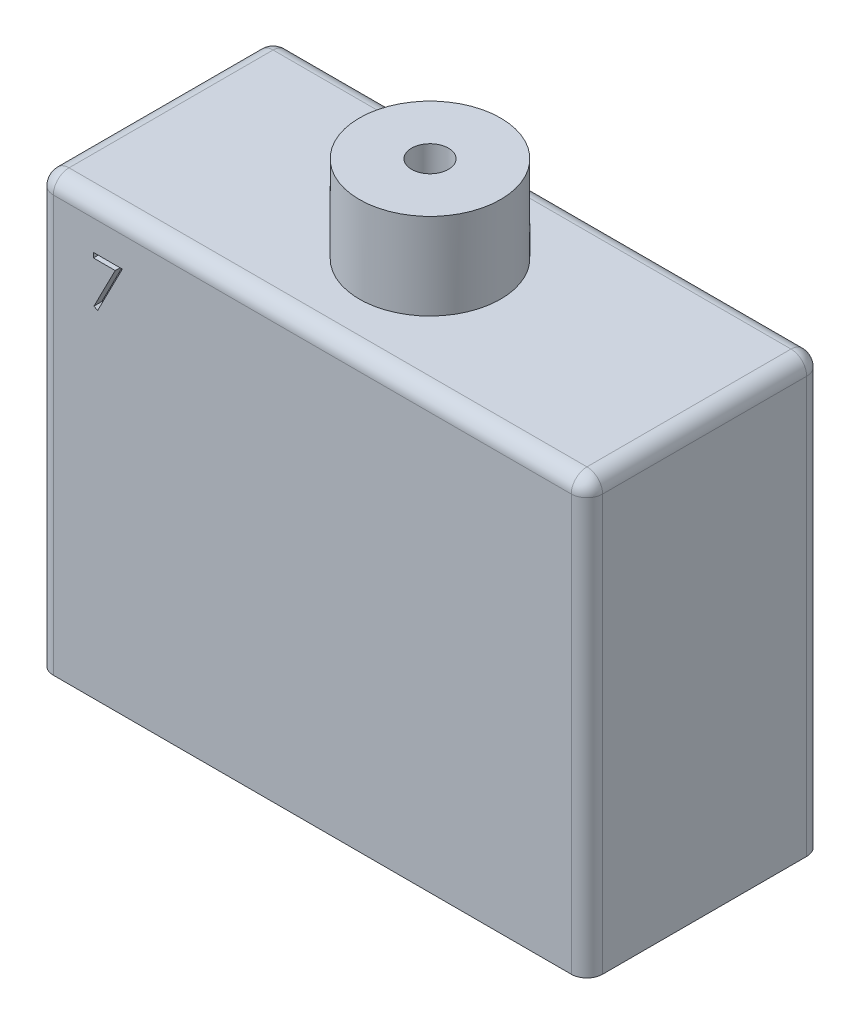
ISO-10303-21;
HEADER;
FILE_DESCRIPTION(('STEP AP214'),'2;1');
FILE_NAME('part.step','',(''),(''),'','','');
FILE_SCHEMA(('AUTOMOTIVE_DESIGN { 1 0 10303 214 1 1 1 1 }'));
ENDSEC;
DATA;
#1=APPLICATION_CONTEXT('core data for automotive mechanical design processes');
#2=APPLICATION_PROTOCOL_DEFINITION('international standard','automotive_design',2000,#1);
#3=PRODUCT_CONTEXT('',#1,'mechanical');
#4=PRODUCT('Part','Part','',(#3));
#5=PRODUCT_RELATED_PRODUCT_CATEGORY('part','',(#4));
#6=PRODUCT_DEFINITION_FORMATION('','',#4);
#7=PRODUCT_DEFINITION_CONTEXT('part definition',#1,'design');
#8=PRODUCT_DEFINITION('design','',#6,#7);
#9=PRODUCT_DEFINITION_SHAPE('','',#8);
#10=(LENGTH_UNIT() NAMED_UNIT(*) SI_UNIT(.MILLI.,.METRE.));
#11=(NAMED_UNIT(*) PLANE_ANGLE_UNIT() SI_UNIT($,.RADIAN.));
#12=(NAMED_UNIT(*) SI_UNIT($,.STERADIAN.) SOLID_ANGLE_UNIT());
#13=UNCERTAINTY_MEASURE_WITH_UNIT(LENGTH_MEASURE(1.E-05),#10,'distance_accuracy_value','');
#14=(GEOMETRIC_REPRESENTATION_CONTEXT(3) GLOBAL_UNCERTAINTY_ASSIGNED_CONTEXT((#13)) GLOBAL_UNIT_ASSIGNED_CONTEXT((#10,
#11,#12)) REPRESENTATION_CONTEXT('',''));
#15=CARTESIAN_POINT('',(0.,0.,0.));
#16=DIRECTION('',(0.,0.,1.));
#17=DIRECTION('',(1.,0.,0.));
#18=AXIS2_PLACEMENT_3D('',#15,#16,#17);
#19=CARTESIAN_POINT('',(-35.,55.,15.));
#20=DIRECTION('',(0.,0.,-1.));
#21=DIRECTION('',(-1.,0.,0.));
#22=AXIS2_PLACEMENT_3D('',#19,#20,#21);
#23=PLANE('',#22);
#24=DIRECTION('',(1.,0.,0.));
#25=VECTOR('',#24,1.);
#26=CARTESIAN_POINT('',(-35.,53.,15.));
#27=LINE('',#26,#25);
#28=CARTESIAN_POINT('',(33.,53.,15.));
#29=VERTEX_POINT('',#28);
#30=CARTESIAN_POINT('',(-33.,53.,15.));
#31=VERTEX_POINT('',#30);
#32=EDGE_CURVE('E203',#29,#31,#27,.F.);
#33=ORIENTED_EDGE('',*,*,#32,.T.);
#34=DIRECTION('',(0.,-1.,0.));
#35=VECTOR('',#34,1.);
#36=CARTESIAN_POINT('',(-33.,55.,15.));
#37=LINE('',#36,#35);
#38=CARTESIAN_POINT('',(-33.,0.,15.));
#39=VERTEX_POINT('',#38);
#40=EDGE_CURVE('E207',#31,#39,#37,.T.);
#41=ORIENTED_EDGE('',*,*,#40,.T.);
#42=DIRECTION('',(1.,0.,0.));
#43=VECTOR('',#42,1.);
#44=CARTESIAN_POINT('',(-35.,0.,15.));
#45=LINE('',#44,#43);
#46=CARTESIAN_POINT('',(33.,0.,15.));
#47=VERTEX_POINT('',#46);
#48=EDGE_CURVE('E200',#39,#47,#45,.T.);
#49=ORIENTED_EDGE('',*,*,#48,.T.);
#50=DIRECTION('',(0.,-1.,0.));
#51=VECTOR('',#50,1.);
#52=CARTESIAN_POINT('',(33.,55.,15.));
#53=LINE('',#52,#51);
#54=EDGE_CURVE('E205',#47,#29,#53,.F.);
#55=ORIENTED_EDGE('',*,*,#54,.T.);
#56=EDGE_LOOP('',(#33,#41,#49,#55));
#57=FACE_BOUND('',#56,.T.);
#58=DIRECTION('',(0.,1.,0.));
#59=VECTOR('',#58,1.);
#60=CARTESIAN_POINT('',(-27.8970044056642,48.6060079094147,15.));
#61=LINE('',#60,#59);
#62=CARTESIAN_POINT('',(-27.8970044056642,48.6060079094147,15.));
#63=VERTEX_POINT('',#62);
#64=CARTESIAN_POINT('',(-27.8970044056642,49.2213925247993,15.));
#65=VERTEX_POINT('',#64);
#66=EDGE_CURVE('E48',#63,#65,#61,.T.);
#67=ORIENTED_EDGE('',*,*,#66,.T.);
#68=DIRECTION('',(1.,0.,0.));
#69=VECTOR('',#68,1.);
#70=CARTESIAN_POINT('',(-27.8970044056642,49.2213925247993,15.));
#71=LINE('',#70,#69);
#72=CARTESIAN_POINT('',(-24.2046967133565,49.2213925247993,15.));
#73=VERTEX_POINT('',#72);
#74=EDGE_CURVE('E167',#65,#73,#71,.T.);
#75=ORIENTED_EDGE('',*,*,#74,.T.);
#76=DIRECTION('',(-0.456090790910399,-0.889933250556876,0.));
#77=VECTOR('',#76,1.);
#78=CARTESIAN_POINT('',(-24.2046967133565,49.2213925247993,15.));
#79=LINE('',#78,#77);
#80=CARTESIAN_POINT('',(-27.3585428672027,43.0675463709531,15.));
#81=VERTEX_POINT('',#80);
#82=EDGE_CURVE('E654',#73,#81,#79,.T.);
#83=ORIENTED_EDGE('',*,*,#82,.T.);
#84=DIRECTION('',(-0.876072484374677,0.48217942938452,0.));
#85=VECTOR('',#84,1.);
#86=CARTESIAN_POINT('',(-27.3585428672027,43.0675463709531,15.));
#87=LINE('',#86,#85);
#88=CARTESIAN_POINT('',(-27.8236870979719,43.3235559863377,15.));
#89=VERTEX_POINT('',#88);
#90=EDGE_CURVE('E657',#81,#89,#87,.T.);
#91=ORIENTED_EDGE('',*,*,#90,.T.);
#92=DIRECTION('',(0.456180989989924,0.889887017756644,0.));
#93=VECTOR('',#92,1.);
#94=CARTESIAN_POINT('',(-27.8236870979719,43.3235559863377,15.));
#95=LINE('',#94,#93);
#96=CARTESIAN_POINT('',(-25.1157544056642,48.6060079094147,15.));
#97=VERTEX_POINT('',#96);
#98=EDGE_CURVE('E660',#89,#97,#95,.T.);
#99=ORIENTED_EDGE('',*,*,#98,.T.);
#100=DIRECTION('',(-1.,0.,0.));
#101=VECTOR('',#100,1.);
#102=CARTESIAN_POINT('',(-25.1157544056642,48.6060079094147,15.));
#103=LINE('',#102,#101);
#104=EDGE_CURVE('E163',#97,#63,#103,.T.);
#105=ORIENTED_EDGE('',*,*,#104,.T.);
#106=EDGE_LOOP('',(#67,#75,#83,#91,#99,#105));
#107=FACE_BOUND('',#106,.T.);
#108=ADVANCED_FACE('F33',(#57,#107),#23,.F.);
#109=CARTESIAN_POINT('',(35.,55.,15.));
#110=DIRECTION('',(-1.,0.,0.));
#111=DIRECTION('',(0.,0.,1.));
#112=AXIS2_PLACEMENT_3D('',#109,#110,#111);
#113=PLANE('',#112);
#114=DIRECTION('',(0.,0.,-1.));
#115=VECTOR('',#114,1.);
#116=CARTESIAN_POINT('',(35.,53.,15.));
#117=LINE('',#116,#115);
#118=CARTESIAN_POINT('',(35.,53.,-13.));
#119=VERTEX_POINT('',#118);
#120=CARTESIAN_POINT('',(35.,53.,13.));
#121=VERTEX_POINT('',#120);
#122=EDGE_CURVE('E224',#119,#121,#117,.F.);
#123=ORIENTED_EDGE('',*,*,#122,.T.);
#124=DIRECTION('',(0.,-1.,0.));
#125=VECTOR('',#124,1.);
#126=CARTESIAN_POINT('',(35.,55.,13.));
#127=LINE('',#126,#125);
#128=CARTESIAN_POINT('',(35.,0.,13.));
#129=VERTEX_POINT('',#128);
#130=EDGE_CURVE('E228',#121,#129,#127,.T.);
#131=ORIENTED_EDGE('',*,*,#130,.T.);
#132=DIRECTION('',(0.,0.,-1.));
#133=VECTOR('',#132,1.);
#134=CARTESIAN_POINT('',(35.,0.,15.));
#135=LINE('',#134,#133);
#136=CARTESIAN_POINT('',(35.,0.,-13.));
#137=VERTEX_POINT('',#136);
#138=EDGE_CURVE('E189',#129,#137,#135,.T.);
#139=ORIENTED_EDGE('',*,*,#138,.T.);
#140=DIRECTION('',(0.,-1.,0.));
#141=VECTOR('',#140,1.);
#142=CARTESIAN_POINT('',(35.,55.,-13.));
#143=LINE('',#142,#141);
#144=EDGE_CURVE('E226',#137,#119,#143,.F.);
#145=ORIENTED_EDGE('',*,*,#144,.T.);
#146=EDGE_LOOP('',(#123,#131,#139,#145));
#147=FACE_BOUND('',#146,.T.);
#148=ADVANCED_FACE('F295',(#147),#113,.F.);
#149=CARTESIAN_POINT('',(-35.,55.,-15.));
#150=DIRECTION('',(0.,0.,1.));
#151=DIRECTION('',(1.,0.,0.));
#152=AXIS2_PLACEMENT_3D('',#149,#150,#151);
#153=PLANE('',#152);
#154=CARTESIAN_POINT('',(-27.5,32.,-15.));
#155=DIRECTION('',(0.,0.,-1.));
#156=DIRECTION('',(-1.,0.,0.));
#157=AXIS2_PLACEMENT_3D('',#154,#155,#156);
#158=CIRCLE('',#157,4.15);
#159=CARTESIAN_POINT('',(-31.65,32.,-15.));
#160=VERTEX_POINT('',#159);
#161=EDGE_CURVE('E182',#160,#160,#158,.T.);
#162=ORIENTED_EDGE('',*,*,#161,.F.);
#163=EDGE_LOOP('',(#162));
#164=FACE_BOUND('',#163,.T.);
#165=CARTESIAN_POINT('',(27.5,32.,-15.));
#166=DIRECTION('',(0.,0.,-1.));
#167=DIRECTION('',(-1.,0.,0.));
#168=AXIS2_PLACEMENT_3D('',#165,#166,#167);
#169=CIRCLE('',#168,4.15);
#170=CARTESIAN_POINT('',(23.35,32.,-15.));
#171=VERTEX_POINT('',#170);
#172=EDGE_CURVE('E181',#171,#171,#169,.T.);
#173=ORIENTED_EDGE('',*,*,#172,.F.);
#174=EDGE_LOOP('',(#173));
#175=FACE_BOUND('',#174,.T.);
#176=DIRECTION('',(-1.,0.,0.));
#177=VECTOR('',#176,1.);
#178=CARTESIAN_POINT('',(-35.,53.,-15.));
#179=LINE('',#178,#177);
#180=CARTESIAN_POINT('',(-33.,53.,-15.));
#181=VERTEX_POINT('',#180);
#182=CARTESIAN_POINT('',(33.,53.,-15.));
#183=VERTEX_POINT('',#182);
#184=EDGE_CURVE('E230',#181,#183,#179,.F.);
#185=ORIENTED_EDGE('',*,*,#184,.T.);
#186=DIRECTION('',(0.,-1.,0.));
#187=VECTOR('',#186,1.);
#188=CARTESIAN_POINT('',(33.,55.,-15.));
#189=LINE('',#188,#187);
#190=CARTESIAN_POINT('',(33.,0.,-15.));
#191=VERTEX_POINT('',#190);
#192=EDGE_CURVE('E234',#183,#191,#189,.T.);
#193=ORIENTED_EDGE('',*,*,#192,.T.);
#194=DIRECTION('',(-1.,0.,0.));
#195=VECTOR('',#194,1.);
#196=CARTESIAN_POINT('',(-35.,0.,-15.));
#197=LINE('',#196,#195);
#198=CARTESIAN_POINT('',(-33.,0.,-15.));
#199=VERTEX_POINT('',#198);
#200=EDGE_CURVE('E194',#191,#199,#197,.T.);
#201=ORIENTED_EDGE('',*,*,#200,.T.);
#202=DIRECTION('',(0.,-1.,0.));
#203=VECTOR('',#202,1.);
#204=CARTESIAN_POINT('',(-33.,55.,-15.));
#205=LINE('',#204,#203);
#206=EDGE_CURVE('E232',#199,#181,#205,.F.);
#207=ORIENTED_EDGE('',*,*,#206,.T.);
#208=EDGE_LOOP('',(#185,#193,#201,#207));
#209=FACE_BOUND('',#208,.T.);
#210=ADVANCED_FACE('F346',(#164,#175,#209),#153,.F.);
#211=CARTESIAN_POINT('',(-35.,55.,15.));
#212=DIRECTION('',(1.,0.,0.));
#213=DIRECTION('',(0.,0.,-1.));
#214=AXIS2_PLACEMENT_3D('',#211,#212,#213);
#215=PLANE('',#214);
#216=DIRECTION('',(0.,0.,1.));
#217=VECTOR('',#216,1.);
#218=CARTESIAN_POINT('',(-35.,0.,15.));
#219=LINE('',#218,#217);
#220=CARTESIAN_POINT('',(-35.,0.,-13.));
#221=VERTEX_POINT('',#220);
#222=CARTESIAN_POINT('',(-35.,0.,13.));
#223=VERTEX_POINT('',#222);
#224=EDGE_CURVE('E197',#221,#223,#219,.T.);
#225=ORIENTED_EDGE('',*,*,#224,.T.);
#226=DIRECTION('',(0.,-1.,0.));
#227=VECTOR('',#226,1.);
#228=CARTESIAN_POINT('',(-35.,55.,13.));
#229=LINE('',#228,#227);
#230=CARTESIAN_POINT('',(-35.,53.,13.));
#231=VERTEX_POINT('',#230);
#232=EDGE_CURVE('E222',#223,#231,#229,.F.);
#233=ORIENTED_EDGE('',*,*,#232,.T.);
#234=DIRECTION('',(0.,0.,1.));
#235=VECTOR('',#234,1.);
#236=CARTESIAN_POINT('',(-35.,53.,15.));
#237=LINE('',#236,#235);
#238=CARTESIAN_POINT('',(-35.,53.,-13.));
#239=VERTEX_POINT('',#238);
#240=EDGE_CURVE('E218',#231,#239,#237,.F.);
#241=ORIENTED_EDGE('',*,*,#240,.T.);
#242=DIRECTION('',(0.,-1.,0.));
#243=VECTOR('',#242,1.);
#244=CARTESIAN_POINT('',(-35.,55.,-13.));
#245=LINE('',#244,#243);
#246=EDGE_CURVE('E220',#239,#221,#245,.T.);
#247=ORIENTED_EDGE('',*,*,#246,.T.);
#248=EDGE_LOOP('',(#225,#233,#241,#247));
#249=FACE_BOUND('',#248,.T.);
#250=ADVANCED_FACE('F318',(#249),#215,.F.);
#251=CARTESIAN_POINT('',(0.,55.,0.));
#252=DIRECTION('',(0.,-1.,0.));
#253=DIRECTION('',(0.,0.,-1.));
#254=AXIS2_PLACEMENT_3D('',#251,#252,#253);
#255=PLANE('',#254);
#256=CARTESIAN_POINT('',(0.,55.,0.));
#257=DIRECTION('',(0.,-1.,0.));
#258=DIRECTION('',(0.,0.,-1.));
#259=AXIS2_PLACEMENT_3D('',#256,#257,#258);
#260=CIRCLE('',#259,9.);
#261=CARTESIAN_POINT('',(0.,55.,-9.));
#262=VERTEX_POINT('',#261);
#263=EDGE_CURVE('E11',#262,#262,#260,.F.);
#264=ORIENTED_EDGE('',*,*,#263,.F.);
#265=EDGE_LOOP('',(#264));
#266=FACE_BOUND('',#265,.T.);
#267=DIRECTION('',(0.,0.,-1.));
#268=VECTOR('',#267,1.);
#269=CARTESIAN_POINT('',(33.,55.,0.));
#270=LINE('',#269,#268);
#271=CARTESIAN_POINT('',(33.,55.,13.));
#272=VERTEX_POINT('',#271);
#273=CARTESIAN_POINT('',(33.,55.,-13.));
#274=VERTEX_POINT('',#273);
#275=EDGE_CURVE('E236',#272,#274,#270,.T.);
#276=ORIENTED_EDGE('',*,*,#275,.T.);
#277=DIRECTION('',(-1.,0.,0.));
#278=VECTOR('',#277,1.);
#279=CARTESIAN_POINT('',(0.,55.,-13.));
#280=LINE('',#279,#278);
#281=CARTESIAN_POINT('',(-33.,55.,-13.));
#282=VERTEX_POINT('',#281);
#283=EDGE_CURVE('E41',#274,#282,#280,.T.);
#284=ORIENTED_EDGE('',*,*,#283,.T.);
#285=DIRECTION('',(0.,0.,1.));
#286=VECTOR('',#285,1.);
#287=CARTESIAN_POINT('',(-33.,55.,0.));
#288=LINE('',#287,#286);
#289=CARTESIAN_POINT('',(-33.,55.,13.));
#290=VERTEX_POINT('',#289);
#291=EDGE_CURVE('E56',#282,#290,#288,.T.);
#292=ORIENTED_EDGE('',*,*,#291,.T.);
#293=DIRECTION('',(1.,0.,0.));
#294=VECTOR('',#293,1.);
#295=CARTESIAN_POINT('',(0.,55.,13.));
#296=LINE('',#295,#294);
#297=EDGE_CURVE('E238',#290,#272,#296,.T.);
#298=ORIENTED_EDGE('',*,*,#297,.T.);
#299=EDGE_LOOP('',(#276,#284,#292,#298));
#300=FACE_BOUND('',#299,.T.);
#301=ADVANCED_FACE('F287',(#266,#300),#255,.F.);
#302=CARTESIAN_POINT('',(0.,0.,0.));
#303=DIRECTION('',(0.,-1.,0.));
#304=DIRECTION('',(0.,0.,-1.));
#305=AXIS2_PLACEMENT_3D('',#302,#303,#304);
#306=PLANE('',#305);
#307=ORIENTED_EDGE('',*,*,#48,.F.);
#308=CARTESIAN_POINT('',(-33.,0.,13.));
#309=DIRECTION('',(0.,-1.,0.));
#310=DIRECTION('',(0.,0.,-1.));
#311=AXIS2_PLACEMENT_3D('',#308,#309,#310);
#312=CIRCLE('',#311,2.);
#313=EDGE_CURVE('E216',#39,#223,#312,.T.);
#314=ORIENTED_EDGE('',*,*,#313,.T.);
#315=ORIENTED_EDGE('',*,*,#224,.F.);
#316=CARTESIAN_POINT('',(-33.,0.,-13.));
#317=DIRECTION('',(0.,-1.,0.));
#318=DIRECTION('',(0.,0.,-1.));
#319=AXIS2_PLACEMENT_3D('',#316,#317,#318);
#320=CIRCLE('',#319,2.);
#321=EDGE_CURVE('E210',#221,#199,#320,.T.);
#322=ORIENTED_EDGE('',*,*,#321,.T.);
#323=ORIENTED_EDGE('',*,*,#200,.F.);
#324=CARTESIAN_POINT('',(33.,0.,-13.));
#325=DIRECTION('',(0.,-1.,0.));
#326=DIRECTION('',(0.,0.,-1.));
#327=AXIS2_PLACEMENT_3D('',#324,#325,#326);
#328=CIRCLE('',#327,2.);
#329=EDGE_CURVE('E212',#191,#137,#328,.T.);
#330=ORIENTED_EDGE('',*,*,#329,.T.);
#331=ORIENTED_EDGE('',*,*,#138,.F.);
#332=CARTESIAN_POINT('',(33.,0.,13.));
#333=DIRECTION('',(0.,-1.,0.));
#334=DIRECTION('',(0.,0.,-1.));
#335=AXIS2_PLACEMENT_3D('',#332,#333,#334);
#336=CIRCLE('',#335,2.);
#337=EDGE_CURVE('E214',#129,#47,#336,.T.);
#338=ORIENTED_EDGE('',*,*,#337,.T.);
#339=EDGE_LOOP('',(#307,#314,#315,#322,#323,#330,#331,#338));
#340=FACE_BOUND('',#339,.T.);
#341=ADVANCED_FACE('F305',(#340),#306,.T.);
#342=CARTESIAN_POINT('',(27.5,32.,12.));
#343=DIRECTION('',(0.,0.,-1.));
#344=DIRECTION('',(-1.,0.,0.));
#345=AXIS2_PLACEMENT_3D('',#342,#343,#344);
#346=CYLINDRICAL_SURFACE('',#345,4.15);
#347=CARTESIAN_POINT('',(27.5,32.,12.));
#348=DIRECTION('',(0.,0.,-1.));
#349=DIRECTION('',(-1.,0.,0.));
#350=AXIS2_PLACEMENT_3D('',#347,#348,#349);
#351=CIRCLE('',#350,4.15);
#352=CARTESIAN_POINT('',(23.35,32.,12.));
#353=VERTEX_POINT('',#352);
#354=EDGE_CURVE('E186',#353,#353,#351,.T.);
#355=ORIENTED_EDGE('',*,*,#354,.F.);
#356=EDGE_LOOP('',(#355));
#357=FACE_BOUND('',#356,.T.);
#358=ORIENTED_EDGE('',*,*,#172,.T.);
#359=EDGE_LOOP('',(#358));
#360=FACE_BOUND('',#359,.T.);
#361=ADVANCED_FACE('F570',(#357,#360),#346,.F.);
#362=CARTESIAN_POINT('',(27.5,32.,12.));
#363=DIRECTION('',(0.,0.,-1.));
#364=DIRECTION('',(-1.,0.,0.));
#365=AXIS2_PLACEMENT_3D('',#362,#363,#364);
#366=PLANE('',#365);
#367=ORIENTED_EDGE('',*,*,#354,.T.);
#368=EDGE_LOOP('',(#367));
#369=FACE_BOUND('',#368,.T.);
#370=ADVANCED_FACE('F561',(#369),#366,.T.);
#371=CARTESIAN_POINT('',(-27.5,32.,12.));
#372=DIRECTION('',(0.,0.,-1.));
#373=DIRECTION('',(-1.,0.,0.));
#374=AXIS2_PLACEMENT_3D('',#371,#372,#373);
#375=CYLINDRICAL_SURFACE('',#374,4.15);
#376=CARTESIAN_POINT('',(-27.5,32.,12.));
#377=DIRECTION('',(0.,0.,-1.));
#378=DIRECTION('',(-1.,0.,0.));
#379=AXIS2_PLACEMENT_3D('',#376,#377,#378);
#380=CIRCLE('',#379,4.15);
#381=CARTESIAN_POINT('',(-31.65,32.,12.));
#382=VERTEX_POINT('',#381);
#383=EDGE_CURVE('E178',#382,#382,#380,.T.);
#384=ORIENTED_EDGE('',*,*,#383,.F.);
#385=EDGE_LOOP('',(#384));
#386=FACE_BOUND('',#385,.T.);
#387=ORIENTED_EDGE('',*,*,#161,.T.);
#388=EDGE_LOOP('',(#387));
#389=FACE_BOUND('',#388,.T.);
#390=ADVANCED_FACE('F551',(#386,#389),#375,.F.);
#391=CARTESIAN_POINT('',(-27.5,32.,12.));
#392=DIRECTION('',(0.,0.,-1.));
#393=DIRECTION('',(-1.,0.,0.));
#394=AXIS2_PLACEMENT_3D('',#391,#392,#393);
#395=PLANE('',#394);
#396=ORIENTED_EDGE('',*,*,#383,.T.);
#397=EDGE_LOOP('',(#396));
#398=FACE_BOUND('',#397,.T.);
#399=ADVANCED_FACE('F543',(#398),#395,.T.);
#400=CARTESIAN_POINT('',(33.,55.,-13.));
#401=DIRECTION('',(0.,-1.,0.));
#402=DIRECTION('',(0.,0.,-1.));
#403=AXIS2_PLACEMENT_3D('',#400,#401,#402);
#404=CYLINDRICAL_SURFACE('',#403,2.);
#405=CARTESIAN_POINT('',(33.,53.,-13.));
#406=DIRECTION('',(0.,1.,0.));
#407=DIRECTION('',(0.,0.,1.));
#408=AXIS2_PLACEMENT_3D('',#405,#406,#407);
#409=CIRCLE('',#408,2.);
#410=EDGE_CURVE('E185',#119,#183,#409,.T.);
#411=ORIENTED_EDGE('',*,*,#410,.F.);
#412=ORIENTED_EDGE('',*,*,#144,.F.);
#413=ORIENTED_EDGE('',*,*,#329,.F.);
#414=ORIENTED_EDGE('',*,*,#192,.F.);
#415=EDGE_LOOP('',(#411,#412,#413,#414));
#416=FACE_BOUND('',#415,.T.);
#417=ADVANCED_FACE('F35',(#416),#404,.T.);
#418=CARTESIAN_POINT('',(33.,53.,-13.));
#419=DIRECTION('',(0.,0.,1.));
#420=DIRECTION('',(1.,0.,0.));
#421=AXIS2_PLACEMENT_3D('',#418,#419,#420);
#422=SPHERICAL_SURFACE('',#421,2.);
#423=CARTESIAN_POINT('',(33.,53.,-13.));
#424=DIRECTION('',(0.,0.,-1.));
#425=DIRECTION('',(-1.,0.,0.));
#426=AXIS2_PLACEMENT_3D('',#423,#424,#425);
#427=CIRCLE('',#426,2.);
#428=EDGE_CURVE('E265',#119,#274,#427,.F.);
#429=ORIENTED_EDGE('',*,*,#428,.F.);
#430=ORIENTED_EDGE('',*,*,#410,.T.);
#431=CARTESIAN_POINT('',(33.,53.,-13.));
#432=DIRECTION('',(1.,0.,0.));
#433=DIRECTION('',(0.,0.,-1.));
#434=AXIS2_PLACEMENT_3D('',#431,#432,#433);
#435=CIRCLE('',#434,2.);
#436=EDGE_CURVE('E268',#274,#183,#435,.F.);
#437=ORIENTED_EDGE('',*,*,#436,.F.);
#438=EDGE_LOOP('',(#429,#430,#437));
#439=FACE_BOUND('',#438,.T.);
#440=ADVANCED_FACE('F275',(#439),#422,.T.);
#441=CARTESIAN_POINT('',(-33.,55.,-13.));
#442=DIRECTION('',(0.,-1.,0.));
#443=DIRECTION('',(0.,0.,-1.));
#444=AXIS2_PLACEMENT_3D('',#441,#442,#443);
#445=CYLINDRICAL_SURFACE('',#444,2.);
#446=ORIENTED_EDGE('',*,*,#321,.F.);
#447=ORIENTED_EDGE('',*,*,#246,.F.);
#448=CARTESIAN_POINT('',(-33.,53.,-13.));
#449=DIRECTION('',(0.,1.,0.));
#450=DIRECTION('',(0.,0.,1.));
#451=AXIS2_PLACEMENT_3D('',#448,#449,#450);
#452=CIRCLE('',#451,2.);
#453=EDGE_CURVE('E262',#181,#239,#452,.T.);
#454=ORIENTED_EDGE('',*,*,#453,.F.);
#455=ORIENTED_EDGE('',*,*,#206,.F.);
#456=EDGE_LOOP('',(#446,#447,#454,#455));
#457=FACE_BOUND('',#456,.T.);
#458=ADVANCED_FACE('F322',(#457),#445,.T.);
#459=CARTESIAN_POINT('',(0.,53.,-13.));
#460=DIRECTION('',(-1.,0.,0.));
#461=DIRECTION('',(0.,0.,1.));
#462=AXIS2_PLACEMENT_3D('',#459,#460,#461);
#463=CYLINDRICAL_SURFACE('',#462,2.);
#464=ORIENTED_EDGE('',*,*,#436,.T.);
#465=ORIENTED_EDGE('',*,*,#184,.F.);
#466=CARTESIAN_POINT('',(-33.,53.,-13.));
#467=DIRECTION('',(-1.,0.,0.));
#468=DIRECTION('',(0.,0.,1.));
#469=AXIS2_PLACEMENT_3D('',#466,#467,#468);
#470=CIRCLE('',#469,2.);
#471=EDGE_CURVE('E259',#282,#181,#470,.T.);
#472=ORIENTED_EDGE('',*,*,#471,.F.);
#473=ORIENTED_EDGE('',*,*,#283,.F.);
#474=EDGE_LOOP('',(#464,#465,#472,#473));
#475=FACE_BOUND('',#474,.T.);
#476=ADVANCED_FACE('F283',(#475),#463,.T.);
#477=CARTESIAN_POINT('',(33.,53.,0.));
#478=DIRECTION('',(0.,0.,-1.));
#479=DIRECTION('',(-1.,0.,0.));
#480=AXIS2_PLACEMENT_3D('',#477,#478,#479);
#481=CYLINDRICAL_SURFACE('',#480,2.);
#482=ORIENTED_EDGE('',*,*,#428,.T.);
#483=ORIENTED_EDGE('',*,*,#275,.F.);
#484=CARTESIAN_POINT('',(33.,53.,13.));
#485=DIRECTION('',(0.,0.,1.));
#486=DIRECTION('',(1.,0.,0.));
#487=AXIS2_PLACEMENT_3D('',#484,#485,#486);
#488=CIRCLE('',#487,2.);
#489=EDGE_CURVE('E256',#121,#272,#488,.T.);
#490=ORIENTED_EDGE('',*,*,#489,.F.);
#491=ORIENTED_EDGE('',*,*,#122,.F.);
#492=EDGE_LOOP('',(#482,#483,#490,#491));
#493=FACE_BOUND('',#492,.T.);
#494=ADVANCED_FACE('F292',(#493),#481,.T.);
#495=CARTESIAN_POINT('',(33.,55.,13.));
#496=DIRECTION('',(0.,-1.,0.));
#497=DIRECTION('',(0.,0.,-1.));
#498=AXIS2_PLACEMENT_3D('',#495,#496,#497);
#499=CYLINDRICAL_SURFACE('',#498,2.);
#500=ORIENTED_EDGE('',*,*,#337,.F.);
#501=ORIENTED_EDGE('',*,*,#130,.F.);
#502=CARTESIAN_POINT('',(33.,53.,13.));
#503=DIRECTION('',(0.,1.,0.));
#504=DIRECTION('',(0.,0.,1.));
#505=AXIS2_PLACEMENT_3D('',#502,#503,#504);
#506=CIRCLE('',#505,2.);
#507=EDGE_CURVE('E253',#29,#121,#506,.T.);
#508=ORIENTED_EDGE('',*,*,#507,.F.);
#509=ORIENTED_EDGE('',*,*,#54,.F.);
#510=EDGE_LOOP('',(#500,#501,#508,#509));
#511=FACE_BOUND('',#510,.T.);
#512=ADVANCED_FACE('F300',(#511),#499,.T.);
#513=CARTESIAN_POINT('',(-33.,53.,-13.));
#514=DIRECTION('',(0.,0.,1.));
#515=DIRECTION('',(1.,0.,0.));
#516=AXIS2_PLACEMENT_3D('',#513,#514,#515);
#517=SPHERICAL_SURFACE('',#516,2.);
#518=ORIENTED_EDGE('',*,*,#471,.T.);
#519=ORIENTED_EDGE('',*,*,#453,.T.);
#520=CARTESIAN_POINT('',(-33.,53.,-13.));
#521=DIRECTION('',(0.,0.,-1.));
#522=DIRECTION('',(0.,1.,0.));
#523=AXIS2_PLACEMENT_3D('',#520,#521,#522);
#524=CIRCLE('',#523,2.);
#525=EDGE_CURVE('E251',#282,#239,#524,.F.);
#526=ORIENTED_EDGE('',*,*,#525,.F.);
#527=EDGE_LOOP('',(#518,#519,#526));
#528=FACE_BOUND('',#527,.T.);
#529=ADVANCED_FACE('F325',(#528),#517,.T.);
#530=CARTESIAN_POINT('',(33.,53.,13.));
#531=DIRECTION('',(0.,0.,1.));
#532=DIRECTION('',(1.,0.,0.));
#533=AXIS2_PLACEMENT_3D('',#530,#531,#532);
#534=SPHERICAL_SURFACE('',#533,2.);
#535=ORIENTED_EDGE('',*,*,#507,.T.);
#536=ORIENTED_EDGE('',*,*,#489,.T.);
#537=CARTESIAN_POINT('',(33.,53.,13.));
#538=DIRECTION('',(1.,0.,0.));
#539=DIRECTION('',(0.,0.,-1.));
#540=AXIS2_PLACEMENT_3D('',#537,#538,#539);
#541=CIRCLE('',#540,2.);
#542=EDGE_CURVE('E248',#29,#272,#541,.F.);
#543=ORIENTED_EDGE('',*,*,#542,.F.);
#544=EDGE_LOOP('',(#535,#536,#543));
#545=FACE_BOUND('',#544,.T.);
#546=ADVANCED_FACE('F332',(#545),#534,.T.);
#547=CARTESIAN_POINT('',(-33.,53.,0.));
#548=DIRECTION('',(0.,0.,1.));
#549=DIRECTION('',(1.,0.,0.));
#550=AXIS2_PLACEMENT_3D('',#547,#548,#549);
#551=CYLINDRICAL_SURFACE('',#550,2.);
#552=ORIENTED_EDGE('',*,*,#525,.T.);
#553=ORIENTED_EDGE('',*,*,#240,.F.);
#554=CARTESIAN_POINT('',(-33.,53.,13.));
#555=DIRECTION('',(0.,0.,1.));
#556=DIRECTION('',(1.,0.,0.));
#557=AXIS2_PLACEMENT_3D('',#554,#555,#556);
#558=CIRCLE('',#557,2.);
#559=EDGE_CURVE('E245',#290,#231,#558,.T.);
#560=ORIENTED_EDGE('',*,*,#559,.F.);
#561=ORIENTED_EDGE('',*,*,#291,.F.);
#562=EDGE_LOOP('',(#552,#553,#560,#561));
#563=FACE_BOUND('',#562,.T.);
#564=ADVANCED_FACE('F326',(#563),#551,.T.);
#565=CARTESIAN_POINT('',(0.,53.,13.));
#566=DIRECTION('',(1.,0.,0.));
#567=DIRECTION('',(0.,0.,-1.));
#568=AXIS2_PLACEMENT_3D('',#565,#566,#567);
#569=CYLINDRICAL_SURFACE('',#568,2.);
#570=ORIENTED_EDGE('',*,*,#542,.T.);
#571=ORIENTED_EDGE('',*,*,#297,.F.);
#572=CARTESIAN_POINT('',(-33.,53.,13.));
#573=DIRECTION('',(-1.,0.,0.));
#574=DIRECTION('',(0.,0.,1.));
#575=AXIS2_PLACEMENT_3D('',#572,#573,#574);
#576=CIRCLE('',#575,2.);
#577=EDGE_CURVE('E172',#31,#290,#576,.T.);
#578=ORIENTED_EDGE('',*,*,#577,.F.);
#579=ORIENTED_EDGE('',*,*,#32,.F.);
#580=EDGE_LOOP('',(#570,#571,#578,#579));
#581=FACE_BOUND('',#580,.T.);
#582=ADVANCED_FACE('F330',(#581),#569,.T.);
#583=CARTESIAN_POINT('',(-33.,53.,13.));
#584=DIRECTION('',(0.,0.,1.));
#585=DIRECTION('',(1.,0.,0.));
#586=AXIS2_PLACEMENT_3D('',#583,#584,#585);
#587=SPHERICAL_SURFACE('',#586,2.);
#588=ORIENTED_EDGE('',*,*,#577,.T.);
#589=ORIENTED_EDGE('',*,*,#559,.T.);
#590=CARTESIAN_POINT('',(-33.,53.,13.));
#591=DIRECTION('',(0.,1.,0.));
#592=DIRECTION('',(0.,0.,1.));
#593=AXIS2_PLACEMENT_3D('',#590,#591,#592);
#594=CIRCLE('',#593,2.);
#595=EDGE_CURVE('E168',#31,#231,#594,.F.);
#596=ORIENTED_EDGE('',*,*,#595,.F.);
#597=EDGE_LOOP('',(#588,#589,#596));
#598=FACE_BOUND('',#597,.T.);
#599=ADVANCED_FACE('F328',(#598),#587,.T.);
#600=CARTESIAN_POINT('',(-33.,55.,13.));
#601=DIRECTION('',(0.,-1.,0.));
#602=DIRECTION('',(0.,0.,-1.));
#603=AXIS2_PLACEMENT_3D('',#600,#601,#602);
#604=CYLINDRICAL_SURFACE('',#603,2.);
#605=ORIENTED_EDGE('',*,*,#595,.T.);
#606=ORIENTED_EDGE('',*,*,#232,.F.);
#607=ORIENTED_EDGE('',*,*,#313,.F.);
#608=ORIENTED_EDGE('',*,*,#40,.F.);
#609=EDGE_LOOP('',(#605,#606,#607,#608));
#610=FACE_BOUND('',#609,.T.);
#611=ADVANCED_FACE('F312',(#610),#604,.T.);
#612=CARTESIAN_POINT('',(-27.8970044056642,48.6060079094147,14.));
#613=DIRECTION('',(1.,0.,0.));
#614=DIRECTION('',(0.,0.,-1.));
#615=AXIS2_PLACEMENT_3D('',#612,#613,#614);
#616=PLANE('',#615);
#617=ORIENTED_EDGE('',*,*,#66,.F.);
#618=DIRECTION('',(0.,0.,1.));
#619=VECTOR('',#618,1.);
#620=CARTESIAN_POINT('',(-27.8970044056642,48.6060079094147,14.));
#621=LINE('',#620,#619);
#622=CARTESIAN_POINT('',(-27.8970044056642,48.6060079094147,14.));
#623=VERTEX_POINT('',#622);
#624=EDGE_CURVE('E162',#623,#63,#621,.T.);
#625=ORIENTED_EDGE('',*,*,#624,.F.);
#626=DIRECTION('',(0.,1.,0.));
#627=VECTOR('',#626,1.);
#628=CARTESIAN_POINT('',(-27.8970044056642,48.6060079094147,14.));
#629=LINE('',#628,#627);
#630=CARTESIAN_POINT('',(-27.8970044056642,49.2213925247993,14.));
#631=VERTEX_POINT('',#630);
#632=EDGE_CURVE('E153',#623,#631,#629,.T.);
#633=ORIENTED_EDGE('',*,*,#632,.T.);
#634=DIRECTION('',(0.,0.,1.));
#635=VECTOR('',#634,1.);
#636=CARTESIAN_POINT('',(-27.8970044056642,49.2213925247993,14.));
#637=LINE('',#636,#635);
#638=EDGE_CURVE('E161',#631,#65,#637,.T.);
#639=ORIENTED_EDGE('',*,*,#638,.T.);
#640=EDGE_LOOP('',(#617,#625,#633,#639));
#641=FACE_BOUND('',#640,.T.);
#642=ADVANCED_FACE('F160',(#641),#616,.T.);
#643=CARTESIAN_POINT('',(-27.8970044056642,49.2213925247993,14.));
#644=DIRECTION('',(0.,-1.,0.));
#645=DIRECTION('',(0.,0.,-1.));
#646=AXIS2_PLACEMENT_3D('',#643,#644,#645);
#647=PLANE('',#646);
#648=ORIENTED_EDGE('',*,*,#74,.F.);
#649=ORIENTED_EDGE('',*,*,#638,.F.);
#650=DIRECTION('',(1.,0.,0.));
#651=VECTOR('',#650,1.);
#652=CARTESIAN_POINT('',(-27.8970044056642,49.2213925247993,14.));
#653=LINE('',#652,#651);
#654=CARTESIAN_POINT('',(-24.2046967133565,49.2213925247993,14.));
#655=VERTEX_POINT('',#654);
#656=EDGE_CURVE('E149',#631,#655,#653,.T.);
#657=ORIENTED_EDGE('',*,*,#656,.T.);
#658=DIRECTION('',(0.,0.,1.));
#659=VECTOR('',#658,1.);
#660=CARTESIAN_POINT('',(-24.2046967133565,49.2213925247993,14.));
#661=LINE('',#660,#659);
#662=EDGE_CURVE('E169',#655,#73,#661,.T.);
#663=ORIENTED_EDGE('',*,*,#662,.T.);
#664=EDGE_LOOP('',(#648,#649,#657,#663));
#665=FACE_BOUND('',#664,.T.);
#666=ADVANCED_FACE('F165',(#665),#647,.T.);
#667=CARTESIAN_POINT('',(-24.2046967133565,49.2213925247993,14.));
#668=DIRECTION('',(-0.889933250556876,0.456090790910399,0.));
#669=DIRECTION('',(-0.456090790910399,-0.889933250556876,0.));
#670=AXIS2_PLACEMENT_3D('',#667,#668,#669);
#671=PLANE('',#670);
#672=ORIENTED_EDGE('',*,*,#82,.F.);
#673=ORIENTED_EDGE('',*,*,#662,.F.);
#674=DIRECTION('',(-0.456090790910399,-0.889933250556876,0.));
#675=VECTOR('',#674,1.);
#676=CARTESIAN_POINT('',(-24.2046967133565,49.2213925247993,14.));
#677=LINE('',#676,#675);
#678=CARTESIAN_POINT('',(-27.3585428672027,43.0675463709531,14.));
#679=VERTEX_POINT('',#678);
#680=EDGE_CURVE('E155',#655,#679,#677,.T.);
#681=ORIENTED_EDGE('',*,*,#680,.T.);
#682=DIRECTION('',(0.,0.,1.));
#683=VECTOR('',#682,1.);
#684=CARTESIAN_POINT('',(-27.3585428672027,43.0675463709531,14.));
#685=LINE('',#684,#683);
#686=EDGE_CURVE('E174',#679,#81,#685,.T.);
#687=ORIENTED_EDGE('',*,*,#686,.T.);
#688=EDGE_LOOP('',(#672,#673,#681,#687));
#689=FACE_BOUND('',#688,.T.);
#690=ADVANCED_FACE('F385',(#689),#671,.T.);
#691=CARTESIAN_POINT('',(-27.3585428672027,43.0675463709531,14.));
#692=DIRECTION('',(0.48217942938452,0.876072484374677,0.));
#693=DIRECTION('',(-0.876072484374677,0.48217942938452,0.));
#694=AXIS2_PLACEMENT_3D('',#691,#692,#693);
#695=PLANE('',#694);
#696=ORIENTED_EDGE('',*,*,#90,.F.);
#697=ORIENTED_EDGE('',*,*,#686,.F.);
#698=DIRECTION('',(-0.876072484374677,0.48217942938452,0.));
#699=VECTOR('',#698,1.);
#700=CARTESIAN_POINT('',(-27.3585428672027,43.0675463709531,14.));
#701=LINE('',#700,#699);
#702=CARTESIAN_POINT('',(-27.8236870979719,43.3235559863377,14.));
#703=VERTEX_POINT('',#702);
#704=EDGE_CURVE('E646',#679,#703,#701,.T.);
#705=ORIENTED_EDGE('',*,*,#704,.T.);
#706=DIRECTION('',(0.,0.,1.));
#707=VECTOR('',#706,1.);
#708=CARTESIAN_POINT('',(-27.8236870979719,43.3235559863377,14.));
#709=LINE('',#708,#707);
#710=EDGE_CURVE('E668',#703,#89,#709,.T.);
#711=ORIENTED_EDGE('',*,*,#710,.T.);
#712=EDGE_LOOP('',(#696,#697,#705,#711));
#713=FACE_BOUND('',#712,.T.);
#714=ADVANCED_FACE('F392',(#713),#695,.T.);
#715=CARTESIAN_POINT('',(-27.8236870979719,43.3235559863377,14.));
#716=DIRECTION('',(0.889887017756643,-0.456180989989924,0.));
#717=DIRECTION('',(0.456180989989924,0.889887017756644,0.));
#718=AXIS2_PLACEMENT_3D('',#715,#716,#717);
#719=PLANE('',#718);
#720=ORIENTED_EDGE('',*,*,#98,.F.);
#721=ORIENTED_EDGE('',*,*,#710,.F.);
#722=DIRECTION('',(0.456180989989924,0.889887017756644,0.));
#723=VECTOR('',#722,1.);
#724=CARTESIAN_POINT('',(-27.8236870979719,43.3235559863377,14.));
#725=LINE('',#724,#723);
#726=CARTESIAN_POINT('',(-25.1157544056642,48.6060079094147,14.));
#727=VERTEX_POINT('',#726);
#728=EDGE_CURVE('E648',#703,#727,#725,.T.);
#729=ORIENTED_EDGE('',*,*,#728,.T.);
#730=DIRECTION('',(0.,0.,1.));
#731=VECTOR('',#730,1.);
#732=CARTESIAN_POINT('',(-25.1157544056642,48.6060079094147,14.));
#733=LINE('',#732,#731);
#734=EDGE_CURVE('E666',#727,#97,#733,.T.);
#735=ORIENTED_EDGE('',*,*,#734,.T.);
#736=EDGE_LOOP('',(#720,#721,#729,#735));
#737=FACE_BOUND('',#736,.T.);
#738=ADVANCED_FACE('F400',(#737),#719,.T.);
#739=CARTESIAN_POINT('',(-25.1157544056642,48.6060079094147,14.));
#740=DIRECTION('',(0.,1.,0.));
#741=DIRECTION('',(0.,0.,1.));
#742=AXIS2_PLACEMENT_3D('',#739,#740,#741);
#743=PLANE('',#742);
#744=ORIENTED_EDGE('',*,*,#104,.F.);
#745=ORIENTED_EDGE('',*,*,#734,.F.);
#746=DIRECTION('',(-1.,0.,0.));
#747=VECTOR('',#746,1.);
#748=CARTESIAN_POINT('',(-25.1157544056642,48.6060079094147,14.));
#749=LINE('',#748,#747);
#750=EDGE_CURVE('E650',#727,#623,#749,.T.);
#751=ORIENTED_EDGE('',*,*,#750,.T.);
#752=ORIENTED_EDGE('',*,*,#624,.T.);
#753=EDGE_LOOP('',(#744,#745,#751,#752));
#754=FACE_BOUND('',#753,.T.);
#755=ADVANCED_FACE('F408',(#754),#743,.T.);
#756=CARTESIAN_POINT('',(0.,0.,14.));
#757=DIRECTION('',(0.,0.,-1.));
#758=DIRECTION('',(-1.,0.,0.));
#759=AXIS2_PLACEMENT_3D('',#756,#757,#758);
#760=PLANE('',#759);
#761=ORIENTED_EDGE('',*,*,#632,.F.);
#762=ORIENTED_EDGE('',*,*,#750,.F.);
#763=ORIENTED_EDGE('',*,*,#728,.F.);
#764=ORIENTED_EDGE('',*,*,#704,.F.);
#765=ORIENTED_EDGE('',*,*,#680,.F.);
#766=ORIENTED_EDGE('',*,*,#656,.F.);
#767=EDGE_LOOP('',(#761,#762,#763,#764,#765,#766));
#768=FACE_BOUND('',#767,.T.);
#769=ADVANCED_FACE('F151',(#768),#760,.F.);
#770=CARTESIAN_POINT('',(0.,66.,0.));
#771=DIRECTION('',(0.,-1.,0.));
#772=DIRECTION('',(0.,0.,-1.));
#773=AXIS2_PLACEMENT_3D('',#770,#771,#772);
#774=CYLINDRICAL_SURFACE('',#773,9.);
#775=CARTESIAN_POINT('',(0.,66.,0.));
#776=DIRECTION('',(0.,1.,0.));
#777=DIRECTION('',(0.,0.,1.));
#778=AXIS2_PLACEMENT_3D('',#775,#776,#777);
#779=CIRCLE('',#778,9.);
#780=CARTESIAN_POINT('',(0.,66.,9.));
#781=VERTEX_POINT('',#780);
#782=EDGE_CURVE('E637',#781,#781,#779,.T.);
#783=ORIENTED_EDGE('',*,*,#782,.F.);
#784=EDGE_LOOP('',(#783));
#785=FACE_BOUND('',#784,.T.);
#786=ORIENTED_EDGE('',*,*,#263,.T.);
#787=EDGE_LOOP('',(#786));
#788=FACE_BOUND('',#787,.T.);
#789=ADVANCED_FACE('F423',(#785,#788),#774,.T.);
#790=CARTESIAN_POINT('',(0.,66.,0.));
#791=DIRECTION('',(0.,1.,0.));
#792=DIRECTION('',(0.,0.,1.));
#793=AXIS2_PLACEMENT_3D('',#790,#791,#792);
#794=PLANE('',#793);
#795=CARTESIAN_POINT('',(0.,66.,0.));
#796=DIRECTION('',(0.,1.,0.));
#797=DIRECTION('',(0.,0.,1.));
#798=AXIS2_PLACEMENT_3D('',#795,#796,#797);
#799=CIRCLE('',#798,2.35);
#800=CARTESIAN_POINT('',(0.,66.,2.35));
#801=VERTEX_POINT('',#800);
#802=EDGE_CURVE('E638',#801,#801,#799,.T.);
#803=ORIENTED_EDGE('',*,*,#802,.F.);
#804=EDGE_LOOP('',(#803));
#805=FACE_BOUND('',#804,.T.);
#806=ORIENTED_EDGE('',*,*,#782,.T.);
#807=EDGE_LOOP('',(#806));
#808=FACE_BOUND('',#807,.T.);
#809=ADVANCED_FACE('F431',(#805,#808),#794,.T.);
#810=CARTESIAN_POINT('',(0.,22.,0.));
#811=DIRECTION('',(0.,1.,0.));
#812=DIRECTION('',(0.,0.,1.));
#813=AXIS2_PLACEMENT_3D('',#810,#811,#812);
#814=CYLINDRICAL_SURFACE('',#813,2.35);
#815=CARTESIAN_POINT('',(0.,22.,0.));
#816=DIRECTION('',(0.,1.,0.));
#817=DIRECTION('',(0.,0.,1.));
#818=AXIS2_PLACEMENT_3D('',#815,#816,#817);
#819=CIRCLE('',#818,2.35);
#820=CARTESIAN_POINT('',(0.,22.,2.35));
#821=VERTEX_POINT('',#820);
#822=EDGE_CURVE('E636',#821,#821,#819,.T.);
#823=ORIENTED_EDGE('',*,*,#822,.F.);
#824=EDGE_LOOP('',(#823));
#825=FACE_BOUND('',#824,.T.);
#826=ORIENTED_EDGE('',*,*,#802,.T.);
#827=EDGE_LOOP('',(#826));
#828=FACE_BOUND('',#827,.T.);
#829=ADVANCED_FACE('F439',(#825,#828),#814,.F.);
#830=CARTESIAN_POINT('',(0.,22.,0.));
#831=DIRECTION('',(0.,1.,0.));
#832=DIRECTION('',(0.,0.,1.));
#833=AXIS2_PLACEMENT_3D('',#830,#831,#832);
#834=PLANE('',#833);
#835=ORIENTED_EDGE('',*,*,#822,.T.);
#836=EDGE_LOOP('',(#835));
#837=FACE_BOUND('',#836,.T.);
#838=ADVANCED_FACE('F447',(#837),#834,.T.);
#839=CLOSED_SHELL('',(#108,#148,#210,#250,#301,#341,#361,#370,#390,#399,#417,#440,#458,#476,
#494,#512,#529,#546,#564,#582,#599,#611,#642,#666,#690,#714,#738,#755,#769,#789,#809,#829,#838));
#840=MANIFOLD_SOLID_BREP('B2',#839);
#841=ADVANCED_BREP_SHAPE_REPRESENTATION('',(#18,#840),#14);
#842=SHAPE_DEFINITION_REPRESENTATION(#9,#841);
ENDSEC;
END-ISO-10303-21;
